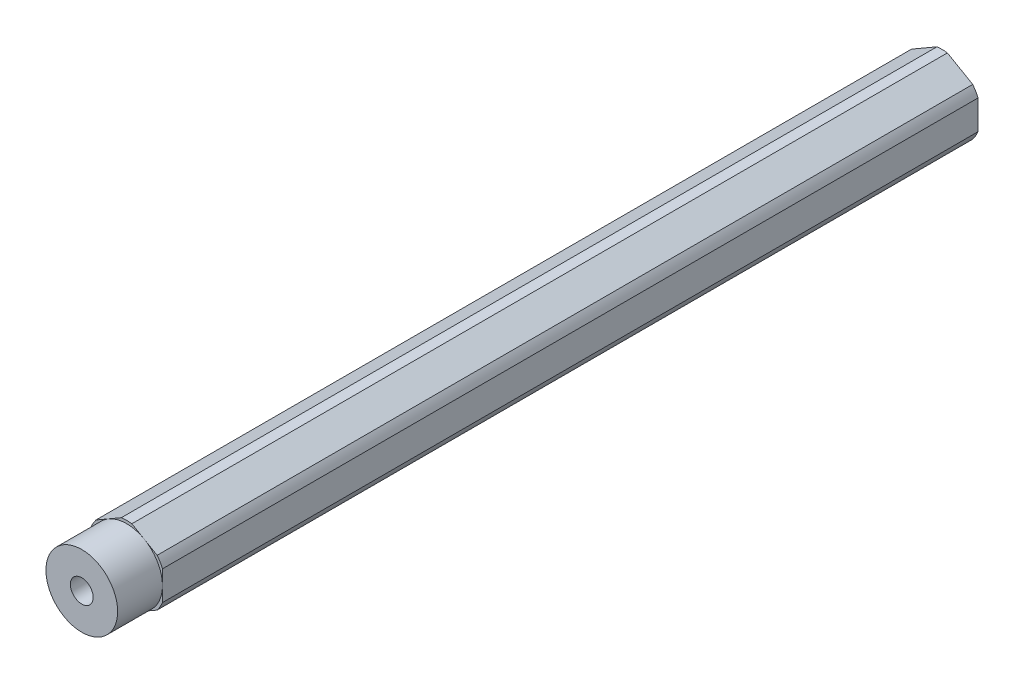
ISO-10303-21;
HEADER;
FILE_DESCRIPTION(('STEP AP214'),'2;1');
FILE_NAME('part.step','',(''),(''),'','','');
FILE_SCHEMA(('AUTOMOTIVE_DESIGN { 1 0 10303 214 1 1 1 1 }'));
ENDSEC;
DATA;
#1=APPLICATION_CONTEXT('core data for automotive mechanical design processes');
#2=APPLICATION_PROTOCOL_DEFINITION('international standard','automotive_design',2000,#1);
#3=PRODUCT_CONTEXT('',#1,'mechanical');
#4=PRODUCT('Part','Part','',(#3));
#5=PRODUCT_RELATED_PRODUCT_CATEGORY('part','',(#4));
#6=PRODUCT_DEFINITION_FORMATION('','',#4);
#7=PRODUCT_DEFINITION_CONTEXT('part definition',#1,'design');
#8=PRODUCT_DEFINITION('design','',#6,#7);
#9=PRODUCT_DEFINITION_SHAPE('','',#8);
#10=(LENGTH_UNIT() NAMED_UNIT(*) SI_UNIT(.MILLI.,.METRE.));
#11=(NAMED_UNIT(*) PLANE_ANGLE_UNIT() SI_UNIT($,.RADIAN.));
#12=(NAMED_UNIT(*) SI_UNIT($,.STERADIAN.) SOLID_ANGLE_UNIT());
#13=UNCERTAINTY_MEASURE_WITH_UNIT(LENGTH_MEASURE(1.E-05),#10,'distance_accuracy_value','');
#14=(GEOMETRIC_REPRESENTATION_CONTEXT(3) GLOBAL_UNCERTAINTY_ASSIGNED_CONTEXT((#13)) GLOBAL_UNIT_ASSIGNED_CONTEXT((#10,
#11,#12)) REPRESENTATION_CONTEXT('',''));
#15=CARTESIAN_POINT('',(0.,0.,0.));
#16=DIRECTION('',(0.,0.,1.));
#17=DIRECTION('',(1.,0.,0.));
#18=AXIS2_PLACEMENT_3D('',#15,#16,#17);
#19=CARTESIAN_POINT('',(0.,0.,-72.23125));
#20=DIRECTION('',(0.,0.,1.));
#21=DIRECTION('',(1.,0.,0.));
#22=AXIS2_PLACEMENT_3D('',#19,#20,#21);
#23=PLANE('',#22);
#24=DIRECTION('',(0.,1.,0.));
#25=VECTOR('',#24,1.);
#26=CARTESIAN_POINT('',(6.35,0.,-72.23125));
#27=LINE('',#26,#25);
#28=CARTESIAN_POINT('',(6.35,-2.59030191290513,-72.23125));
#29=VERTEX_POINT('',#28);
#30=CARTESIAN_POINT('',(6.35,2.59030191290514,-72.23125));
#31=VERTEX_POINT('',#30);
#32=EDGE_CURVE('E206',#29,#31,#27,.T.);
#33=ORIENTED_EDGE('',*,*,#32,.F.);
#34=CARTESIAN_POINT('',(0.,0.,-72.23125));
#35=DIRECTION('',(0.,0.,1.));
#36=DIRECTION('',(1.,0.,0.));
#37=AXIS2_PLACEMENT_3D('',#34,#35,#36);
#38=CIRCLE('',#37,6.858);
#39=CARTESIAN_POINT('',(5.41826726004727,-4.20411035757862,-72.23125));
#40=VERTEX_POINT('',#39);
#41=EDGE_CURVE('E168',#40,#29,#38,.T.);
#42=ORIENTED_EDGE('',*,*,#41,.F.);
#43=DIRECTION('',(0.866025403784439,0.5,0.));
#44=VECTOR('',#43,1.);
#45=CARTESIAN_POINT('',(3.175,-5.49926131403119,-72.23125));
#46=LINE('',#45,#44);
#47=CARTESIAN_POINT('',(0.931732739952726,-6.79441227048375,-72.23125));
#48=VERTEX_POINT('',#47);
#49=EDGE_CURVE('E222',#48,#40,#46,.T.);
#50=ORIENTED_EDGE('',*,*,#49,.F.);
#51=CARTESIAN_POINT('',(-0.931732739952714,-6.79441227048375,-72.23125));
#52=VERTEX_POINT('',#51);
#53=EDGE_CURVE('E221',#52,#48,#38,.T.);
#54=ORIENTED_EDGE('',*,*,#53,.F.);
#55=DIRECTION('',(0.866025403784439,-0.5,0.));
#56=VECTOR('',#55,1.);
#57=CARTESIAN_POINT('',(-3.175,-5.49926131403118,-72.23125));
#58=LINE('',#57,#56);
#59=CARTESIAN_POINT('',(-5.41826726004728,-4.20411035757861,-72.23125));
#60=VERTEX_POINT('',#59);
#61=EDGE_CURVE('E219',#60,#52,#58,.T.);
#62=ORIENTED_EDGE('',*,*,#61,.F.);
#63=CARTESIAN_POINT('',(-6.35,-2.59030191290514,-72.23125));
#64=VERTEX_POINT('',#63);
#65=EDGE_CURVE('E218',#64,#60,#38,.T.);
#66=ORIENTED_EDGE('',*,*,#65,.F.);
#67=DIRECTION('',(0.,-1.,0.));
#68=VECTOR('',#67,1.);
#69=CARTESIAN_POINT('',(-6.35,0.,-72.23125));
#70=LINE('',#69,#68);
#71=CARTESIAN_POINT('',(-6.35,2.59030191290514,-72.23125));
#72=VERTEX_POINT('',#71);
#73=EDGE_CURVE('E216',#72,#64,#70,.T.);
#74=ORIENTED_EDGE('',*,*,#73,.F.);
#75=CARTESIAN_POINT('',(-5.41826726004728,4.20411035757862,-72.23125));
#76=VERTEX_POINT('',#75);
#77=EDGE_CURVE('E215',#76,#72,#38,.T.);
#78=ORIENTED_EDGE('',*,*,#77,.F.);
#79=DIRECTION('',(-0.866025403784439,-0.5,0.));
#80=VECTOR('',#79,1.);
#81=CARTESIAN_POINT('',(-3.175,5.49926131403118,-72.23125));
#82=LINE('',#81,#80);
#83=CARTESIAN_POINT('',(-0.931732739952721,6.79441227048375,-72.23125));
#84=VERTEX_POINT('',#83);
#85=EDGE_CURVE('E213',#84,#76,#82,.T.);
#86=ORIENTED_EDGE('',*,*,#85,.F.);
#87=CARTESIAN_POINT('',(0.931732739952725,6.79441227048375,-72.23125));
#88=VERTEX_POINT('',#87);
#89=EDGE_CURVE('E211',#88,#84,#38,.T.);
#90=ORIENTED_EDGE('',*,*,#89,.F.);
#91=DIRECTION('',(-0.866025403784439,0.5,0.));
#92=VECTOR('',#91,1.);
#93=CARTESIAN_POINT('',(3.175,5.49926131403119,-72.23125));
#94=LINE('',#93,#92);
#95=CARTESIAN_POINT('',(5.41826726004727,4.20411035757862,-72.23125));
#96=VERTEX_POINT('',#95);
#97=EDGE_CURVE('E210',#96,#88,#94,.T.);
#98=ORIENTED_EDGE('',*,*,#97,.F.);
#99=EDGE_CURVE('E208',#31,#96,#38,.T.);
#100=ORIENTED_EDGE('',*,*,#99,.F.);
#101=EDGE_LOOP('',(#33,#42,#50,#54,#62,#66,#74,#78,#86,#90,#98,#100));
#102=FACE_BOUND('',#101,.T.);
#103=CARTESIAN_POINT('',(0.,0.,-72.23125));
#104=DIRECTION('',(0.,0.,-1.));
#105=DIRECTION('',(-1.,0.,0.));
#106=AXIS2_PLACEMENT_3D('',#103,#104,#105);
#107=CIRCLE('',#106,2.01929999999999);
#108=CARTESIAN_POINT('',(-2.01929999999999,0.,-72.23125));
#109=VERTEX_POINT('',#108);
#110=EDGE_CURVE('E348',#109,#109,#107,.T.);
#111=ORIENTED_EDGE('',*,*,#110,.F.);
#112=EDGE_LOOP('',(#111));
#113=FACE_BOUND('',#112,.T.);
#114=ADVANCED_FACE('F42',(#102,#113),#23,.F.);
#115=CARTESIAN_POINT('',(0.,0.,72.23125));
#116=DIRECTION('',(0.,0.,1.));
#117=DIRECTION('',(1.,0.,0.));
#118=AXIS2_PLACEMENT_3D('',#115,#116,#117);
#119=PLANE('',#118);
#120=CARTESIAN_POINT('',(0.,0.,72.23125));
#121=DIRECTION('',(0.,0.,1.));
#122=DIRECTION('',(1.,0.,0.));
#123=AXIS2_PLACEMENT_3D('',#120,#121,#122);
#124=CIRCLE('',#123,6.35);
#125=CARTESIAN_POINT('',(6.35,0.,72.23125));
#126=VERTEX_POINT('',#125);
#127=CARTESIAN_POINT('',(3.175,5.49926131403119,72.23125));
#128=VERTEX_POINT('',#127);
#129=EDGE_CURVE('E53',#126,#128,#124,.T.);
#130=ORIENTED_EDGE('',*,*,#129,.F.);
#131=DIRECTION('',(0.,1.,0.));
#132=VECTOR('',#131,1.);
#133=CARTESIAN_POINT('',(6.35,0.,72.23125));
#134=LINE('',#133,#132);
#135=CARTESIAN_POINT('',(6.35,2.59030191290514,72.23125));
#136=VERTEX_POINT('',#135);
#137=EDGE_CURVE('E160',#126,#136,#134,.T.);
#138=ORIENTED_EDGE('',*,*,#137,.T.);
#139=CARTESIAN_POINT('',(0.,0.,72.23125));
#140=DIRECTION('',(0.,0.,1.));
#141=DIRECTION('',(1.,0.,0.));
#142=AXIS2_PLACEMENT_3D('',#139,#140,#141);
#143=CIRCLE('',#142,6.858);
#144=CARTESIAN_POINT('',(5.41826726004727,4.20411035757862,72.23125));
#145=VERTEX_POINT('',#144);
#146=EDGE_CURVE('E159',#136,#145,#143,.T.);
#147=ORIENTED_EDGE('',*,*,#146,.T.);
#148=DIRECTION('',(-0.866025403784439,0.5,0.));
#149=VECTOR('',#148,1.);
#150=CARTESIAN_POINT('',(3.175,5.49926131403119,72.23125));
#151=LINE('',#150,#149);
#152=EDGE_CURVE('E173',#145,#128,#151,.T.);
#153=ORIENTED_EDGE('',*,*,#152,.T.);
#154=EDGE_LOOP('',(#130,#138,#147,#153));
#155=FACE_BOUND('',#154,.T.);
#156=ADVANCED_FACE('F171',(#155),#119,.T.);
#157=CARTESIAN_POINT('',(-3.175,5.49926131403119,72.23125));
#158=VERTEX_POINT('',#157);
#159=EDGE_CURVE('E11',#128,#158,#124,.T.);
#160=ORIENTED_EDGE('',*,*,#159,.F.);
#161=CARTESIAN_POINT('',(0.931732739952725,6.79441227048375,72.23125));
#162=VERTEX_POINT('',#161);
#163=EDGE_CURVE('E185',#128,#162,#151,.T.);
#164=ORIENTED_EDGE('',*,*,#163,.T.);
#165=CARTESIAN_POINT('',(-0.931732739952721,6.79441227048375,72.23125));
#166=VERTEX_POINT('',#165);
#167=EDGE_CURVE('E186',#162,#166,#143,.T.);
#168=ORIENTED_EDGE('',*,*,#167,.T.);
#169=DIRECTION('',(-0.866025403784439,-0.5,0.));
#170=VECTOR('',#169,1.);
#171=CARTESIAN_POINT('',(-3.175,5.49926131403118,72.23125));
#172=LINE('',#171,#170);
#173=EDGE_CURVE('E188',#166,#158,#172,.T.);
#174=ORIENTED_EDGE('',*,*,#173,.T.);
#175=EDGE_LOOP('',(#160,#164,#168,#174));
#176=FACE_BOUND('',#175,.T.);
#177=ADVANCED_FACE('F308',(#176),#119,.T.);
#178=CARTESIAN_POINT('',(-6.35,0.,72.23125));
#179=VERTEX_POINT('',#178);
#180=EDGE_CURVE('E51',#158,#179,#124,.T.);
#181=ORIENTED_EDGE('',*,*,#180,.F.);
#182=CARTESIAN_POINT('',(-5.41826726004728,4.20411035757862,72.23125));
#183=VERTEX_POINT('',#182);
#184=EDGE_CURVE('E192',#158,#183,#172,.T.);
#185=ORIENTED_EDGE('',*,*,#184,.T.);
#186=CARTESIAN_POINT('',(-6.35,2.59030191290514,72.23125));
#187=VERTEX_POINT('',#186);
#188=EDGE_CURVE('E191',#183,#187,#143,.T.);
#189=ORIENTED_EDGE('',*,*,#188,.T.);
#190=DIRECTION('',(0.,-1.,0.));
#191=VECTOR('',#190,1.);
#192=CARTESIAN_POINT('',(-6.35,0.,72.23125));
#193=LINE('',#192,#191);
#194=EDGE_CURVE('E193',#187,#179,#193,.T.);
#195=ORIENTED_EDGE('',*,*,#194,.T.);
#196=EDGE_LOOP('',(#181,#185,#189,#195));
#197=FACE_BOUND('',#196,.T.);
#198=ADVANCED_FACE('F296',(#197),#119,.T.);
#199=CARTESIAN_POINT('',(-3.175,-5.49926131403118,72.23125));
#200=VERTEX_POINT('',#199);
#201=EDGE_CURVE('E179',#179,#200,#124,.T.);
#202=ORIENTED_EDGE('',*,*,#201,.F.);
#203=CARTESIAN_POINT('',(-6.35,-2.59030191290514,72.23125));
#204=VERTEX_POINT('',#203);
#205=EDGE_CURVE('E197',#179,#204,#193,.T.);
#206=ORIENTED_EDGE('',*,*,#205,.T.);
#207=CARTESIAN_POINT('',(-5.41826726004728,-4.20411035757861,72.23125));
#208=VERTEX_POINT('',#207);
#209=EDGE_CURVE('E196',#204,#208,#143,.T.);
#210=ORIENTED_EDGE('',*,*,#209,.T.);
#211=DIRECTION('',(0.866025403784439,-0.5,0.));
#212=VECTOR('',#211,1.);
#213=CARTESIAN_POINT('',(-3.175,-5.49926131403118,72.23125));
#214=LINE('',#213,#212);
#215=EDGE_CURVE('E198',#208,#200,#214,.T.);
#216=ORIENTED_EDGE('',*,*,#215,.T.);
#217=EDGE_LOOP('',(#202,#206,#210,#216));
#218=FACE_BOUND('',#217,.T.);
#219=ADVANCED_FACE('F434',(#218),#119,.T.);
#220=CARTESIAN_POINT('',(3.175,-5.49926131403119,72.23125));
#221=VERTEX_POINT('',#220);
#222=EDGE_CURVE('E68',#200,#221,#124,.T.);
#223=ORIENTED_EDGE('',*,*,#222,.F.);
#224=CARTESIAN_POINT('',(-0.931732739952714,-6.79441227048375,72.23125));
#225=VERTEX_POINT('',#224);
#226=EDGE_CURVE('E202',#200,#225,#214,.T.);
#227=ORIENTED_EDGE('',*,*,#226,.T.);
#228=CARTESIAN_POINT('',(0.931732739952726,-6.79441227048375,72.23125));
#229=VERTEX_POINT('',#228);
#230=EDGE_CURVE('E201',#225,#229,#143,.T.);
#231=ORIENTED_EDGE('',*,*,#230,.T.);
#232=DIRECTION('',(0.866025403784439,0.5,0.));
#233=VECTOR('',#232,1.);
#234=CARTESIAN_POINT('',(3.175,-5.49926131403119,72.23125));
#235=LINE('',#234,#233);
#236=EDGE_CURVE('E203',#229,#221,#235,.T.);
#237=ORIENTED_EDGE('',*,*,#236,.T.);
#238=EDGE_LOOP('',(#223,#227,#231,#237));
#239=FACE_BOUND('',#238,.T.);
#240=ADVANCED_FACE('F331',(#239),#119,.T.);
#241=CARTESIAN_POINT('',(6.35,0.,72.23125));
#242=DIRECTION('',(-1.,0.,0.));
#243=DIRECTION('',(0.,-1.,0.));
#244=AXIS2_PLACEMENT_3D('',#241,#242,#243);
#245=PLANE('',#244);
#246=ORIENTED_EDGE('',*,*,#32,.T.);
#247=DIRECTION('',(0.,0.,-1.));
#248=VECTOR('',#247,1.);
#249=CARTESIAN_POINT('',(6.35,2.59030191290514,72.23125));
#250=LINE('',#249,#248);
#251=EDGE_CURVE('E46',#136,#31,#250,.T.);
#252=ORIENTED_EDGE('',*,*,#251,.F.);
#253=ORIENTED_EDGE('',*,*,#137,.F.);
#254=CARTESIAN_POINT('',(6.35,-2.59030191290513,72.23125));
#255=VERTEX_POINT('',#254);
#256=EDGE_CURVE('E151',#255,#126,#134,.T.);
#257=ORIENTED_EDGE('',*,*,#256,.F.);
#258=DIRECTION('',(0.,0.,-1.));
#259=VECTOR('',#258,1.);
#260=CARTESIAN_POINT('',(6.35,-2.59030191290513,72.23125));
#261=LINE('',#260,#259);
#262=EDGE_CURVE('E224',#255,#29,#261,.T.);
#263=ORIENTED_EDGE('',*,*,#262,.T.);
#264=EDGE_LOOP('',(#246,#252,#253,#257,#263));
#265=FACE_BOUND('',#264,.T.);
#266=ADVANCED_FACE('F44',(#265),#245,.F.);
#267=CARTESIAN_POINT('',(0.,0.,72.23125));
#268=DIRECTION('',(0.,0.,-1.));
#269=DIRECTION('',(-1.,0.,0.));
#270=AXIS2_PLACEMENT_3D('',#267,#268,#269);
#271=CYLINDRICAL_SURFACE('',#270,6.858);
#272=ORIENTED_EDGE('',*,*,#99,.T.);
#273=DIRECTION('',(0.,0.,-1.));
#274=VECTOR('',#273,1.);
#275=CARTESIAN_POINT('',(5.41826726004727,4.20411035757862,72.23125));
#276=LINE('',#275,#274);
#277=EDGE_CURVE('E180',#145,#96,#276,.T.);
#278=ORIENTED_EDGE('',*,*,#277,.F.);
#279=ORIENTED_EDGE('',*,*,#146,.F.);
#280=ORIENTED_EDGE('',*,*,#251,.T.);
#281=EDGE_LOOP('',(#272,#278,#279,#280));
#282=FACE_BOUND('',#281,.T.);
#283=ADVANCED_FACE('F312',(#282),#271,.T.);
#284=CARTESIAN_POINT('',(3.175,5.49926131403119,72.23125));
#285=DIRECTION('',(-0.5,-0.866025403784439,0.));
#286=DIRECTION('',(0.866025403784439,-0.5,0.));
#287=AXIS2_PLACEMENT_3D('',#284,#285,#286);
#288=PLANE('',#287);
#289=ORIENTED_EDGE('',*,*,#97,.T.);
#290=DIRECTION('',(0.,0.,-1.));
#291=VECTOR('',#290,1.);
#292=CARTESIAN_POINT('',(0.931732739952725,6.79441227048375,72.23125));
#293=LINE('',#292,#291);
#294=EDGE_CURVE('E250',#162,#88,#293,.T.);
#295=ORIENTED_EDGE('',*,*,#294,.F.);
#296=ORIENTED_EDGE('',*,*,#163,.F.);
#297=ORIENTED_EDGE('',*,*,#152,.F.);
#298=ORIENTED_EDGE('',*,*,#277,.T.);
#299=EDGE_LOOP('',(#289,#295,#296,#297,#298));
#300=FACE_BOUND('',#299,.T.);
#301=ADVANCED_FACE('F256',(#300),#288,.F.);
#302=ORIENTED_EDGE('',*,*,#89,.T.);
#303=DIRECTION('',(0.,0.,-1.));
#304=VECTOR('',#303,1.);
#305=CARTESIAN_POINT('',(-0.931732739952721,6.79441227048375,72.23125));
#306=LINE('',#305,#304);
#307=EDGE_CURVE('E247',#166,#84,#306,.T.);
#308=ORIENTED_EDGE('',*,*,#307,.F.);
#309=ORIENTED_EDGE('',*,*,#167,.F.);
#310=ORIENTED_EDGE('',*,*,#294,.T.);
#311=EDGE_LOOP('',(#302,#308,#309,#310));
#312=FACE_BOUND('',#311,.T.);
#313=ADVANCED_FACE('F309',(#312),#271,.T.);
#314=CARTESIAN_POINT('',(-3.175,5.49926131403118,72.23125));
#315=DIRECTION('',(0.5,-0.866025403784439,0.));
#316=DIRECTION('',(0.866025403784439,0.5,0.));
#317=AXIS2_PLACEMENT_3D('',#314,#315,#316);
#318=PLANE('',#317);
#319=ORIENTED_EDGE('',*,*,#85,.T.);
#320=DIRECTION('',(0.,0.,-1.));
#321=VECTOR('',#320,1.);
#322=CARTESIAN_POINT('',(-5.41826726004728,4.20411035757862,72.23125));
#323=LINE('',#322,#321);
#324=EDGE_CURVE('E244',#183,#76,#323,.T.);
#325=ORIENTED_EDGE('',*,*,#324,.F.);
#326=ORIENTED_EDGE('',*,*,#184,.F.);
#327=ORIENTED_EDGE('',*,*,#173,.F.);
#328=ORIENTED_EDGE('',*,*,#307,.T.);
#329=EDGE_LOOP('',(#319,#325,#326,#327,#328));
#330=FACE_BOUND('',#329,.T.);
#331=ADVANCED_FACE('F300',(#330),#318,.F.);
#332=ORIENTED_EDGE('',*,*,#77,.T.);
#333=DIRECTION('',(0.,0.,-1.));
#334=VECTOR('',#333,1.);
#335=CARTESIAN_POINT('',(-6.35,2.59030191290514,72.23125));
#336=LINE('',#335,#334);
#337=EDGE_CURVE('E241',#187,#72,#336,.T.);
#338=ORIENTED_EDGE('',*,*,#337,.F.);
#339=ORIENTED_EDGE('',*,*,#188,.F.);
#340=ORIENTED_EDGE('',*,*,#324,.T.);
#341=EDGE_LOOP('',(#332,#338,#339,#340));
#342=FACE_BOUND('',#341,.T.);
#343=ADVANCED_FACE('F301',(#342),#271,.T.);
#344=CARTESIAN_POINT('',(-6.35,0.,72.23125));
#345=DIRECTION('',(1.,0.,0.));
#346=DIRECTION('',(0.,1.,0.));
#347=AXIS2_PLACEMENT_3D('',#344,#345,#346);
#348=PLANE('',#347);
#349=ORIENTED_EDGE('',*,*,#73,.T.);
#350=DIRECTION('',(0.,0.,-1.));
#351=VECTOR('',#350,1.);
#352=CARTESIAN_POINT('',(-6.35,-2.59030191290514,72.23125));
#353=LINE('',#352,#351);
#354=EDGE_CURVE('E238',#204,#64,#353,.T.);
#355=ORIENTED_EDGE('',*,*,#354,.F.);
#356=ORIENTED_EDGE('',*,*,#205,.F.);
#357=ORIENTED_EDGE('',*,*,#194,.F.);
#358=ORIENTED_EDGE('',*,*,#337,.T.);
#359=EDGE_LOOP('',(#349,#355,#356,#357,#358));
#360=FACE_BOUND('',#359,.T.);
#361=ADVANCED_FACE('F306',(#360),#348,.F.);
#362=ORIENTED_EDGE('',*,*,#65,.T.);
#363=DIRECTION('',(0.,0.,-1.));
#364=VECTOR('',#363,1.);
#365=CARTESIAN_POINT('',(-5.41826726004728,-4.20411035757861,72.23125));
#366=LINE('',#365,#364);
#367=EDGE_CURVE('E235',#208,#60,#366,.T.);
#368=ORIENTED_EDGE('',*,*,#367,.F.);
#369=ORIENTED_EDGE('',*,*,#209,.F.);
#370=ORIENTED_EDGE('',*,*,#354,.T.);
#371=EDGE_LOOP('',(#362,#368,#369,#370));
#372=FACE_BOUND('',#371,.T.);
#373=ADVANCED_FACE('F321',(#372),#271,.T.);
#374=CARTESIAN_POINT('',(-3.175,-5.49926131403118,72.23125));
#375=DIRECTION('',(0.5,0.866025403784439,0.));
#376=DIRECTION('',(-0.866025403784439,0.5,0.));
#377=AXIS2_PLACEMENT_3D('',#374,#375,#376);
#378=PLANE('',#377);
#379=ORIENTED_EDGE('',*,*,#61,.T.);
#380=DIRECTION('',(0.,0.,-1.));
#381=VECTOR('',#380,1.);
#382=CARTESIAN_POINT('',(-0.931732739952714,-6.79441227048375,72.23125));
#383=LINE('',#382,#381);
#384=EDGE_CURVE('E232',#225,#52,#383,.T.);
#385=ORIENTED_EDGE('',*,*,#384,.F.);
#386=ORIENTED_EDGE('',*,*,#226,.F.);
#387=ORIENTED_EDGE('',*,*,#215,.F.);
#388=ORIENTED_EDGE('',*,*,#367,.T.);
#389=EDGE_LOOP('',(#379,#385,#386,#387,#388));
#390=FACE_BOUND('',#389,.T.);
#391=ADVANCED_FACE('F382',(#390),#378,.F.);
#392=ORIENTED_EDGE('',*,*,#53,.T.);
#393=DIRECTION('',(0.,0.,-1.));
#394=VECTOR('',#393,1.);
#395=CARTESIAN_POINT('',(0.931732739952726,-6.79441227048375,72.23125));
#396=LINE('',#395,#394);
#397=EDGE_CURVE('E229',#229,#48,#396,.T.);
#398=ORIENTED_EDGE('',*,*,#397,.F.);
#399=ORIENTED_EDGE('',*,*,#230,.F.);
#400=ORIENTED_EDGE('',*,*,#384,.T.);
#401=EDGE_LOOP('',(#392,#398,#399,#400));
#402=FACE_BOUND('',#401,.T.);
#403=ADVANCED_FACE('F286',(#402),#271,.T.);
#404=CARTESIAN_POINT('',(3.175,-5.49926131403119,72.23125));
#405=DIRECTION('',(-0.5,0.866025403784439,0.));
#406=DIRECTION('',(-0.866025403784439,-0.5,0.));
#407=AXIS2_PLACEMENT_3D('',#404,#405,#406);
#408=PLANE('',#407);
#409=ORIENTED_EDGE('',*,*,#49,.T.);
#410=DIRECTION('',(0.,0.,-1.));
#411=VECTOR('',#410,1.);
#412=CARTESIAN_POINT('',(5.41826726004727,-4.20411035757862,72.23125));
#413=LINE('',#412,#411);
#414=CARTESIAN_POINT('',(5.41826726004727,-4.20411035757862,72.23125));
#415=VERTEX_POINT('',#414);
#416=EDGE_CURVE('E226',#415,#40,#413,.T.);
#417=ORIENTED_EDGE('',*,*,#416,.F.);
#418=EDGE_CURVE('E205',#221,#415,#235,.T.);
#419=ORIENTED_EDGE('',*,*,#418,.F.);
#420=ORIENTED_EDGE('',*,*,#236,.F.);
#421=ORIENTED_EDGE('',*,*,#397,.T.);
#422=EDGE_LOOP('',(#409,#417,#419,#420,#421));
#423=FACE_BOUND('',#422,.T.);
#424=ADVANCED_FACE('F283',(#423),#408,.F.);
#425=ORIENTED_EDGE('',*,*,#41,.T.);
#426=ORIENTED_EDGE('',*,*,#262,.F.);
#427=EDGE_CURVE('E155',#415,#255,#143,.T.);
#428=ORIENTED_EDGE('',*,*,#427,.F.);
#429=ORIENTED_EDGE('',*,*,#416,.T.);
#430=EDGE_LOOP('',(#425,#426,#428,#429));
#431=FACE_BOUND('',#430,.T.);
#432=ADVANCED_FACE('F278',(#431),#271,.T.);
#433=EDGE_CURVE('E60',#221,#126,#124,.T.);
#434=ORIENTED_EDGE('',*,*,#433,.F.);
#435=ORIENTED_EDGE('',*,*,#418,.T.);
#436=ORIENTED_EDGE('',*,*,#427,.T.);
#437=ORIENTED_EDGE('',*,*,#256,.T.);
#438=EDGE_LOOP('',(#434,#435,#436,#437));
#439=FACE_BOUND('',#438,.T.);
#440=ADVANCED_FACE('F153',(#439),#119,.T.);
#441=CARTESIAN_POINT('',(0.,0.,80.16875));
#442=DIRECTION('',(0.,0.,1.));
#443=DIRECTION('',(1.,0.,0.));
#444=AXIS2_PLACEMENT_3D('',#441,#442,#443);
#445=PLANE('',#444);
#446=CARTESIAN_POINT('',(0.,0.,80.16875));
#447=DIRECTION('',(0.,0.,1.));
#448=DIRECTION('',(1.,0.,0.));
#449=AXIS2_PLACEMENT_3D('',#446,#447,#448);
#450=CIRCLE('',#449,6.35);
#451=CARTESIAN_POINT('',(6.35,0.,80.16875));
#452=VERTEX_POINT('',#451);
#453=EDGE_CURVE('E175',#452,#452,#450,.T.);
#454=ORIENTED_EDGE('',*,*,#453,.T.);
#455=EDGE_LOOP('',(#454));
#456=FACE_BOUND('',#455,.T.);
#457=CARTESIAN_POINT('',(0.,0.,80.16875));
#458=DIRECTION('',(0.,0.,1.));
#459=DIRECTION('',(1.,0.,0.));
#460=AXIS2_PLACEMENT_3D('',#457,#458,#459);
#461=CIRCLE('',#460,2.0193);
#462=CARTESIAN_POINT('',(2.0193,0.,80.16875));
#463=VERTEX_POINT('',#462);
#464=EDGE_CURVE('E176',#463,#463,#461,.T.);
#465=ORIENTED_EDGE('',*,*,#464,.F.);
#466=EDGE_LOOP('',(#465));
#467=FACE_BOUND('',#466,.T.);
#468=ADVANCED_FACE('F330',(#456,#467),#445,.T.);
#469=CARTESIAN_POINT('',(0.,0.,80.16875));
#470=DIRECTION('',(0.,0.,-1.));
#471=DIRECTION('',(-1.,0.,0.));
#472=AXIS2_PLACEMENT_3D('',#469,#470,#471);
#473=CYLINDRICAL_SURFACE('',#472,6.35);
#474=ORIENTED_EDGE('',*,*,#453,.F.);
#475=EDGE_LOOP('',(#474));
#476=FACE_BOUND('',#475,.T.);
#477=ORIENTED_EDGE('',*,*,#129,.T.);
#478=ORIENTED_EDGE('',*,*,#159,.T.);
#479=ORIENTED_EDGE('',*,*,#180,.T.);
#480=ORIENTED_EDGE('',*,*,#201,.T.);
#481=ORIENTED_EDGE('',*,*,#222,.T.);
#482=ORIENTED_EDGE('',*,*,#433,.T.);
#483=EDGE_LOOP('',(#477,#478,#479,#480,#481,#482));
#484=FACE_BOUND('',#483,.T.);
#485=ADVANCED_FACE('F177',(#476,#484),#473,.T.);
#486=CARTESIAN_POINT('',(0.,0.,80.16875));
#487=DIRECTION('',(0.,0.,-1.));
#488=DIRECTION('',(-1.,0.,0.));
#489=AXIS2_PLACEMENT_3D('',#486,#487,#488);
#490=CYLINDRICAL_SURFACE('',#489,2.0193);
#491=ORIENTED_EDGE('',*,*,#464,.T.);
#492=EDGE_LOOP('',(#491));
#493=FACE_BOUND('',#492,.T.);
#494=ORIENTED_EDGE('',*,*,#110,.T.);
#495=EDGE_LOOP('',(#494));
#496=FACE_BOUND('',#495,.T.);
#497=ADVANCED_FACE('F334',(#493,#496),#490,.F.);
#498=CLOSED_SHELL('',(#114,#156,#177,#198,#219,#240,#266,#283,#301,#313,#331,#343,#361,#373,
#391,#403,#424,#432,#440,#468,#485,#497));
#499=MANIFOLD_SOLID_BREP('B2',#498);
#500=ADVANCED_BREP_SHAPE_REPRESENTATION('',(#18,#499),#14);
#501=SHAPE_DEFINITION_REPRESENTATION(#9,#500);
ENDSEC;
END-ISO-10303-21;
